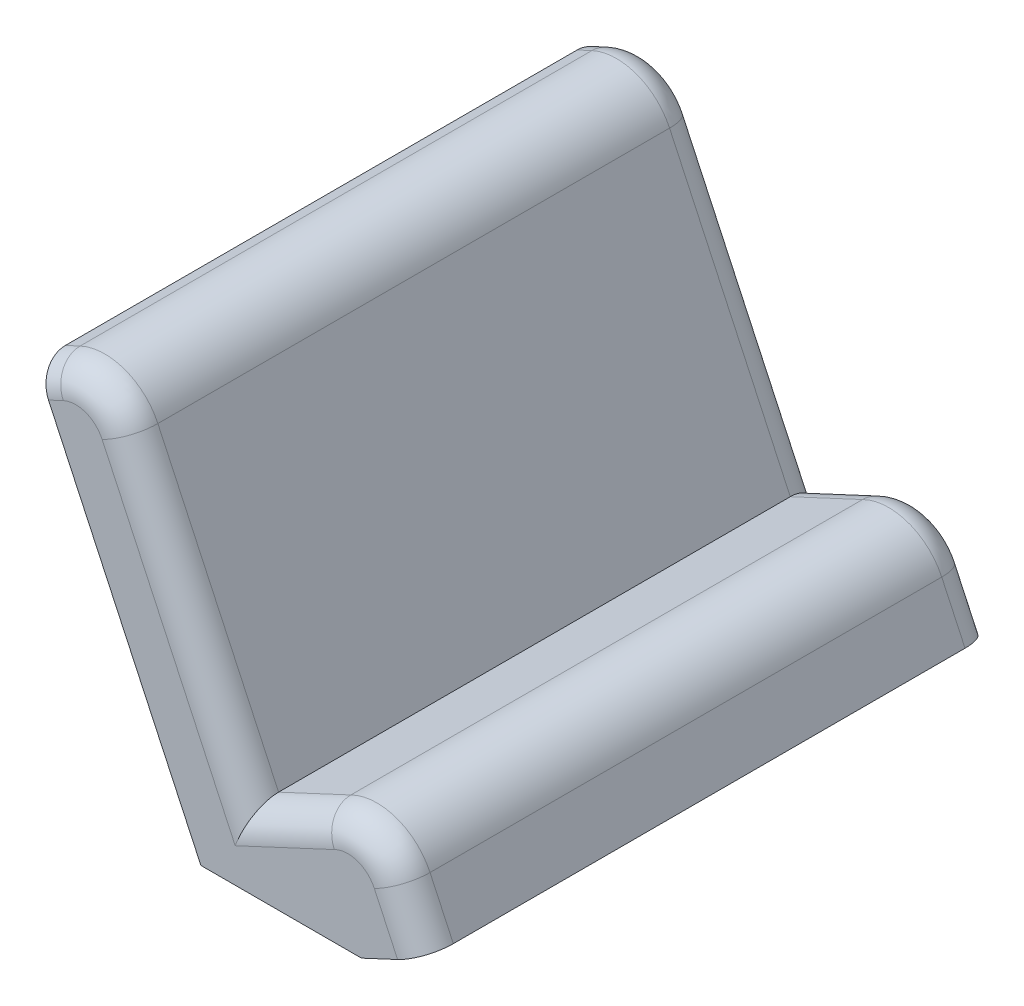
ISO-10303-21;
HEADER;
FILE_DESCRIPTION(('STEP AP214'),'2;1');
FILE_NAME('part.step','',(''),(''),'','','');
FILE_SCHEMA(('AUTOMOTIVE_DESIGN { 1 0 10303 214 1 1 1 1 }'));
ENDSEC;
DATA;
#1=APPLICATION_CONTEXT('core data for automotive mechanical design processes');
#2=APPLICATION_PROTOCOL_DEFINITION('international standard','automotive_design',2000,#1);
#3=PRODUCT_CONTEXT('',#1,'mechanical');
#4=PRODUCT('Part','Part','',(#3));
#5=PRODUCT_RELATED_PRODUCT_CATEGORY('part','',(#4));
#6=PRODUCT_DEFINITION_FORMATION('','',#4);
#7=PRODUCT_DEFINITION_CONTEXT('part definition',#1,'design');
#8=PRODUCT_DEFINITION('design','',#6,#7);
#9=PRODUCT_DEFINITION_SHAPE('','',#8);
#10=(LENGTH_UNIT() NAMED_UNIT(*) SI_UNIT(.MILLI.,.METRE.));
#11=(NAMED_UNIT(*) PLANE_ANGLE_UNIT() SI_UNIT($,.RADIAN.));
#12=(NAMED_UNIT(*) SI_UNIT($,.STERADIAN.) SOLID_ANGLE_UNIT());
#13=UNCERTAINTY_MEASURE_WITH_UNIT(LENGTH_MEASURE(1.E-05),#10,'distance_accuracy_value','');
#14=(GEOMETRIC_REPRESENTATION_CONTEXT(3) GLOBAL_UNCERTAINTY_ASSIGNED_CONTEXT((#13)) GLOBAL_UNIT_ASSIGNED_CONTEXT((#10,
#11,#12)) REPRESENTATION_CONTEXT('',''));
#15=CARTESIAN_POINT('',(0.,0.,0.));
#16=DIRECTION('',(0.,0.,1.));
#17=DIRECTION('',(1.,0.,0.));
#18=AXIS2_PLACEMENT_3D('',#15,#16,#17);
#19=CARTESIAN_POINT('',(-55.9569189786001,120.,97.5));
#20=DIRECTION('',(0.422618261740701,-0.906307787036649,0.));
#21=DIRECTION('',(0.906307787036649,0.422618261740701,0.));
#22=AXIS2_PLACEMENT_3D('',#19,#20,#21);
#23=PLANE('',#22);
#24=DIRECTION('',(-0.906307787036649,-0.422618261740701,0.));
#25=VECTOR('',#24,1.);
#26=CARTESIAN_POINT('',(-55.9569189786001,120.,-87.5));
#27=LINE('',#26,#25);
#28=CARTESIAN_POINT('',(-49.0830747193332,123.205326219061,-87.5));
#29=VERTEX_POINT('',#28);
#30=CARTESIAN_POINT('',(-54.1443034045268,120.845236523481,-87.5));
#31=VERTEX_POINT('',#30);
#32=EDGE_CURVE('E423',#29,#31,#27,.T.);
#33=ORIENTED_EDGE('',*,*,#32,.T.);
#34=DIRECTION('',(0.,0.,1.));
#35=VECTOR('',#34,1.);
#36=CARTESIAN_POINT('',(-54.1443034045268,120.845236523481,97.5));
#37=LINE('',#36,#35);
#38=CARTESIAN_POINT('',(-54.1443034045268,120.845236523481,87.5));
#39=VERTEX_POINT('',#38);
#40=EDGE_CURVE('E69',#31,#39,#37,.T.);
#41=ORIENTED_EDGE('',*,*,#40,.T.);
#42=DIRECTION('',(-0.906307787036649,-0.422618261740701,0.));
#43=VECTOR('',#42,1.);
#44=CARTESIAN_POINT('',(-49.0830747193332,123.205326219061,87.5));
#45=LINE('',#44,#43);
#46=CARTESIAN_POINT('',(-49.0830747193332,123.205326219061,87.5));
#47=VERTEX_POINT('',#46);
#48=EDGE_CURVE('E272',#39,#47,#45,.F.);
#49=ORIENTED_EDGE('',*,*,#48,.T.);
#50=DIRECTION('',(0.,0.,-1.));
#51=VECTOR('',#50,1.);
#52=CARTESIAN_POINT('',(-49.0830747193332,123.205326219061,97.5));
#53=LINE('',#52,#51);
#54=EDGE_CURVE('E209',#47,#29,#53,.T.);
#55=ORIENTED_EDGE('',*,*,#54,.T.);
#56=EDGE_LOOP('',(#33,#41,#49,#55));
#57=FACE_BOUND('',#56,.T.);
#58=ADVANCED_FACE('F43',(#57),#23,.F.);
#59=CARTESIAN_POINT('',(-55.9569189786001,120.,97.5));
#60=DIRECTION('',(0.906307787036649,0.422618261740701,0.));
#61=DIRECTION('',(-0.422618261740701,0.906307787036649,0.));
#62=AXIS2_PLACEMENT_3D('',#59,#60,#61);
#63=PLANE('',#62);
#64=CARTESIAN_POINT('',(-51.7307363611931,110.936922129634,-87.5));
#65=DIRECTION('',(0.906307787036649,0.422618261740701,0.));
#66=DIRECTION('',(-0.422618261740701,0.906307787036649,0.));
#67=AXIS2_PLACEMENT_3D('',#64,#65,#66);
#68=CIRCLE('',#67,8.00000000000005);
#69=CARTESIAN_POINT('',(-55.1116824551187,118.187384425927,-87.5));
#70=VERTEX_POINT('',#69);
#71=CARTESIAN_POINT('',(-51.7307363611931,110.936922129634,-95.5));
#72=VERTEX_POINT('',#71);
#73=EDGE_CURVE('E367',#70,#72,#68,.F.);
#74=ORIENTED_EDGE('',*,*,#73,.T.);
#75=DIRECTION('',(0.422618261740701,-0.906307787036649,0.));
#76=VECTOR('',#75,1.);
#77=CARTESIAN_POINT('',(-55.9569189786001,120.,-95.5000000000001));
#78=LINE('',#77,#76);
#79=CARTESIAN_POINT('',(0.,0.,-95.5000000000001));
#80=VERTEX_POINT('',#79);
#81=EDGE_CURVE('E370',#72,#80,#78,.T.);
#82=ORIENTED_EDGE('',*,*,#81,.T.);
#83=DIRECTION('',(0.,0.,-1.));
#84=VECTOR('',#83,1.);
#85=CARTESIAN_POINT('',(0.,0.,97.5));
#86=LINE('',#85,#84);
#87=CARTESIAN_POINT('',(0.,0.,95.5000000000001));
#88=VERTEX_POINT('',#87);
#89=EDGE_CURVE('E201',#88,#80,#86,.T.);
#90=ORIENTED_EDGE('',*,*,#89,.F.);
#91=DIRECTION('',(-0.422618261740701,0.906307787036649,0.));
#92=VECTOR('',#91,1.);
#93=CARTESIAN_POINT('',(-51.7307363611931,110.936922129634,95.5000000000001));
#94=LINE('',#93,#92);
#95=CARTESIAN_POINT('',(-51.7307363611931,110.936922129634,95.5000000000001));
#96=VERTEX_POINT('',#95);
#97=EDGE_CURVE('E357',#88,#96,#94,.T.);
#98=ORIENTED_EDGE('',*,*,#97,.T.);
#99=CARTESIAN_POINT('',(-51.7307363611931,110.936922129634,87.5));
#100=DIRECTION('',(0.906307787036649,0.422618261740701,0.));
#101=DIRECTION('',(-0.422618261740701,0.906307787036649,0.));
#102=AXIS2_PLACEMENT_3D('',#99,#100,#101);
#103=CIRCLE('',#102,8.00000000000007);
#104=CARTESIAN_POINT('',(-55.1116824551187,118.187384425927,87.5));
#105=VERTEX_POINT('',#104);
#106=EDGE_CURVE('E360',#96,#105,#103,.F.);
#107=ORIENTED_EDGE('',*,*,#106,.T.);
#108=DIRECTION('',(0.,0.,-1.));
#109=VECTOR('',#108,1.);
#110=CARTESIAN_POINT('',(-55.1116824551187,118.187384425927,97.5));
#111=LINE('',#110,#109);
#112=EDGE_CURVE('E364',#105,#70,#111,.T.);
#113=ORIENTED_EDGE('',*,*,#112,.T.);
#114=EDGE_LOOP('',(#74,#82,#90,#98,#107,#113));
#115=FACE_BOUND('',#114,.T.);
#116=ADVANCED_FACE('F506',(#115),#63,.F.);
#117=CARTESIAN_POINT('',(0.,0.,97.5));
#118=DIRECTION('',(0.,1.,0.));
#119=DIRECTION('',(0.,0.,1.));
#120=AXIS2_PLACEMENT_3D('',#117,#118,#119);
#121=PLANE('',#120);
#122=CARTESIAN_POINT('',(30.,0.,0.));
#123=DIRECTION('',(0.,1.,0.));
#124=DIRECTION('',(0.,0.,1.));
#125=AXIS2_PLACEMENT_3D('',#122,#123,#124);
#126=CIRCLE('',#125,7.5);
#127=CARTESIAN_POINT('',(30.,0.,7.5));
#128=VERTEX_POINT('',#127);
#129=EDGE_CURVE('E242',#128,#128,#126,.F.);
#130=ORIENTED_EDGE('',*,*,#129,.F.);
#131=EDGE_LOOP('',(#130));
#132=FACE_BOUND('',#131,.T.);
#133=ORIENTED_EDGE('',*,*,#89,.T.);
#134=DIRECTION('',(-0.74096564527329,0.,0.671542934237817));
#135=VECTOR('',#134,1.);
#136=CARTESIAN_POINT('',(-30.722032121667,0.,-67.6563830545432));
#137=LINE('',#136,#135);
#138=CARTESIAN_POINT('',(2.20675583792493,0.,-97.5));
#139=VERTEX_POINT('',#138);
#140=EDGE_CURVE('E377',#80,#139,#137,.F.);
#141=ORIENTED_EDGE('',*,*,#140,.T.);
#142=DIRECTION('',(1.,0.,0.));
#143=VECTOR('',#142,1.);
#144=CARTESIAN_POINT('',(0.,0.,-97.5));
#145=LINE('',#144,#143);
#146=CARTESIAN_POINT('',(57.1,0.,-97.5));
#147=VERTEX_POINT('',#146);
#148=EDGE_CURVE('E196',#139,#147,#145,.T.);
#149=ORIENTED_EDGE('',*,*,#148,.T.);
#150=DIRECTION('',(0.,0.,-1.));
#151=VECTOR('',#150,1.);
#152=CARTESIAN_POINT('',(57.1,0.,97.5));
#153=LINE('',#152,#151);
#154=CARTESIAN_POINT('',(57.1,0.,97.5));
#155=VERTEX_POINT('',#154);
#156=EDGE_CURVE('E192',#155,#147,#153,.T.);
#157=ORIENTED_EDGE('',*,*,#156,.F.);
#158=DIRECTION('',(1.,0.,0.));
#159=VECTOR('',#158,1.);
#160=CARTESIAN_POINT('',(0.,0.,97.5));
#161=LINE('',#160,#159);
#162=CARTESIAN_POINT('',(2.20675583792493,0.,97.5));
#163=VERTEX_POINT('',#162);
#164=EDGE_CURVE('E178',#163,#155,#161,.T.);
#165=ORIENTED_EDGE('',*,*,#164,.F.);
#166=DIRECTION('',(-0.74096564527329,0.,-0.671542934237817));
#167=VECTOR('',#166,1.);
#168=CARTESIAN_POINT('',(-24.0910683230393,0.,73.6660771807977));
#169=LINE('',#168,#167);
#170=EDGE_CURVE('E374',#163,#88,#169,.T.);
#171=ORIENTED_EDGE('',*,*,#170,.T.);
#172=EDGE_LOOP('',(#133,#141,#149,#157,#165,#171));
#173=FACE_BOUND('',#172,.T.);
#174=ADVANCED_FACE('F194',(#132,#173),#121,.F.);
#175=CARTESIAN_POINT('',(57.1,0.,97.5));
#176=DIRECTION('',(-0.422618261740701,0.906307787036649,0.));
#177=DIRECTION('',(-0.906307787036649,-0.422618261740701,0.));
#178=AXIS2_PLACEMENT_3D('',#175,#176,#177);
#179=PLANE('',#178);
#180=DIRECTION('',(0.906307787036649,0.422618261740701,0.));
#181=VECTOR('',#180,1.);
#182=CARTESIAN_POINT('',(57.1,0.,-97.5));
#183=LINE('',#182,#181);
#184=CARTESIAN_POINT('',(69.481991334729,5.77381738259299,-97.5));
#185=VERTEX_POINT('',#184);
#186=EDGE_CURVE('E189',#147,#185,#183,.T.);
#187=ORIENTED_EDGE('',*,*,#186,.T.);
#188=CARTESIAN_POINT('',(69.481991334729,5.77381738259299,-87.5));
#189=DIRECTION('',(-0.422618261740701,0.906307787036649,0.));
#190=DIRECTION('',(-0.906307787036649,-0.422618261740701,0.));
#191=AXIS2_PLACEMENT_3D('',#188,#189,#190);
#192=CIRCLE('',#191,10.);
#193=CARTESIAN_POINT('',(78.5450692050955,10.,-87.5));
#194=VERTEX_POINT('',#193);
#195=EDGE_CURVE('E438',#185,#194,#192,.F.);
#196=ORIENTED_EDGE('',*,*,#195,.T.);
#197=DIRECTION('',(0.,0.,-1.));
#198=VECTOR('',#197,1.);
#199=CARTESIAN_POINT('',(78.5450692050955,10.,97.5));
#200=LINE('',#199,#198);
#201=CARTESIAN_POINT('',(78.5450692050955,10.,87.5));
#202=VERTEX_POINT('',#201);
#203=EDGE_CURVE('E202',#202,#194,#200,.T.);
#204=ORIENTED_EDGE('',*,*,#203,.F.);
#205=CARTESIAN_POINT('',(69.481991334729,5.77381738259297,87.5));
#206=DIRECTION('',(-0.422618261740701,0.906307787036649,0.));
#207=DIRECTION('',(-0.906307787036649,-0.422618261740701,0.));
#208=AXIS2_PLACEMENT_3D('',#205,#206,#207);
#209=CIRCLE('',#208,10.);
#210=CARTESIAN_POINT('',(69.481991334729,5.77381738259299,97.5));
#211=VERTEX_POINT('',#210);
#212=EDGE_CURVE('E207',#202,#211,#209,.F.);
#213=ORIENTED_EDGE('',*,*,#212,.T.);
#214=DIRECTION('',(0.906307787036649,0.422618261740701,0.));
#215=VECTOR('',#214,1.);
#216=CARTESIAN_POINT('',(57.1,0.,97.5));
#217=LINE('',#216,#215);
#218=EDGE_CURVE('E183',#155,#211,#217,.T.);
#219=ORIENTED_EDGE('',*,*,#218,.F.);
#220=ORIENTED_EDGE('',*,*,#156,.T.);
#221=EDGE_LOOP('',(#187,#196,#204,#213,#219,#220));
#222=FACE_BOUND('',#221,.T.);
#223=ADVANCED_FACE('F204',(#222),#179,.F.);
#224=CARTESIAN_POINT('',(78.5450692050955,10.,97.5));
#225=DIRECTION('',(-0.906307787036649,-0.422618261740702,0.));
#226=DIRECTION('',(0.422618261740702,-0.906307787036649,0.));
#227=AXIS2_PLACEMENT_3D('',#224,#225,#226);
#228=PLANE('',#227);
#229=ORIENTED_EDGE('',*,*,#203,.T.);
#230=DIRECTION('',(-0.422618261740702,0.906307787036649,0.));
#231=VECTOR('',#230,1.);
#232=CARTESIAN_POINT('',(78.5450692050955,10.,-87.5));
#233=LINE('',#232,#231);
#234=CARTESIAN_POINT('',(70.5740684534012,27.0938662753953,-87.5));
#235=VERTEX_POINT('',#234);
#236=EDGE_CURVE('E284',#194,#235,#233,.T.);
#237=ORIENTED_EDGE('',*,*,#236,.T.);
#238=DIRECTION('',(0.,0.,-1.));
#239=VECTOR('',#238,1.);
#240=CARTESIAN_POINT('',(70.5740684534012,27.0938662753953,97.5));
#241=LINE('',#240,#239);
#242=CARTESIAN_POINT('',(70.5740684534012,27.0938662753953,87.5));
#243=VERTEX_POINT('',#242);
#244=EDGE_CURVE('E233',#243,#235,#241,.T.);
#245=ORIENTED_EDGE('',*,*,#244,.F.);
#246=DIRECTION('',(-0.422618261740702,0.906307787036649,0.));
#247=VECTOR('',#246,1.);
#248=CARTESIAN_POINT('',(78.5450692050955,9.99999999999997,87.5));
#249=LINE('',#248,#247);
#250=EDGE_CURVE('E264',#243,#202,#249,.F.);
#251=ORIENTED_EDGE('',*,*,#250,.T.);
#252=EDGE_LOOP('',(#229,#237,#245,#251));
#253=FACE_BOUND('',#252,.T.);
#254=ADVANCED_FACE('F427',(#253),#228,.F.);
#255=CARTESIAN_POINT('',(52.4479127126682,18.6415010405812,97.5));
#256=DIRECTION('',(0.,0.,-1.));
#257=DIRECTION('',(-1.,0.,0.));
#258=AXIS2_PLACEMENT_3D('',#255,#256,#257);
#259=CYLINDRICAL_SURFACE('',#258,20.);
#260=ORIENTED_EDGE('',*,*,#244,.T.);
#261=CARTESIAN_POINT('',(52.4479127126682,18.6415010405812,-87.5));
#262=DIRECTION('',(0.,0.,1.));
#263=DIRECTION('',(1.,0.,0.));
#264=AXIS2_PLACEMENT_3D('',#261,#262,#263);
#265=CIRCLE('',#264,20.);
#266=CARTESIAN_POINT('',(43.49,36.5232179556937,-87.5));
#267=VERTEX_POINT('',#266);
#268=EDGE_CURVE('E417',#235,#267,#265,.T.);
#269=ORIENTED_EDGE('',*,*,#268,.T.);
#270=DIRECTION('',(0.,0.,-1.));
#271=VECTOR('',#270,1.);
#272=CARTESIAN_POINT('',(43.49,36.5232179556937,97.5));
#273=LINE('',#272,#271);
#274=CARTESIAN_POINT('',(43.49,36.5232179556937,87.5));
#275=VERTEX_POINT('',#274);
#276=EDGE_CURVE('E229',#275,#267,#273,.T.);
#277=ORIENTED_EDGE('',*,*,#276,.F.);
#278=CARTESIAN_POINT('',(52.4479127126682,18.6415010405812,87.5));
#279=DIRECTION('',(0.,0.,1.));
#280=DIRECTION('',(1.,0.,0.));
#281=AXIS2_PLACEMENT_3D('',#278,#279,#280);
#282=CIRCLE('',#281,20.);
#283=EDGE_CURVE('E275',#275,#243,#282,.F.);
#284=ORIENTED_EDGE('',*,*,#283,.T.);
#285=EDGE_LOOP('',(#260,#269,#277,#284));
#286=FACE_BOUND('',#285,.T.);
#287=ADVANCED_FACE('F432',(#286),#259,.T.);
#288=CARTESIAN_POINT('',(43.49,36.5232179556937,97.5));
#289=DIRECTION('',(0.4226182617407,-0.906307787036649,0.));
#290=DIRECTION('',(0.906307787036649,0.4226182617407,0.));
#291=AXIS2_PLACEMENT_3D('',#288,#289,#290);
#292=PLANE('',#291);
#293=ORIENTED_EDGE('',*,*,#276,.T.);
#294=DIRECTION('',(-0.906307787036649,-0.4226182617407,0.));
#295=VECTOR('',#294,1.);
#296=CARTESIAN_POINT('',(43.49,36.5232179556937,-87.5));
#297=LINE('',#296,#295);
#298=CARTESIAN_POINT('',(18.778379347475,25.,-87.5));
#299=VERTEX_POINT('',#298);
#300=EDGE_CURVE('E422',#267,#299,#297,.T.);
#301=ORIENTED_EDGE('',*,*,#300,.T.);
#302=DIRECTION('',(0.,0.,-1.));
#303=VECTOR('',#302,1.);
#304=CARTESIAN_POINT('',(18.778379347475,25.,97.5));
#305=LINE('',#304,#303);
#306=CARTESIAN_POINT('',(18.778379347475,25.,87.5));
#307=VERTEX_POINT('',#306);
#308=EDGE_CURVE('E225',#307,#299,#305,.T.);
#309=ORIENTED_EDGE('',*,*,#308,.F.);
#310=DIRECTION('',(-0.906307787036649,-0.4226182617407,0.));
#311=VECTOR('',#310,1.);
#312=CARTESIAN_POINT('',(43.49,36.5232179556937,87.5));
#313=LINE('',#312,#311);
#314=EDGE_CURVE('E278',#307,#275,#313,.F.);
#315=ORIENTED_EDGE('',*,*,#314,.T.);
#316=EDGE_LOOP('',(#293,#301,#309,#315));
#317=FACE_BOUND('',#316,.T.);
#318=ADVANCED_FACE('F491',(#317),#292,.F.);
#319=CARTESIAN_POINT('',(18.778379347475,25.,97.5));
#320=DIRECTION('',(-0.906307787036649,-0.422618261740701,0.));
#321=DIRECTION('',(0.422618261740701,-0.906307787036649,0.));
#322=AXIS2_PLACEMENT_3D('',#319,#320,#321);
#323=PLANE('',#322);
#324=ORIENTED_EDGE('',*,*,#308,.T.);
#325=DIRECTION('',(-0.422618261740701,0.906307787036649,0.));
#326=VECTOR('',#325,1.);
#327=CARTESIAN_POINT('',(18.778379347475,25.,-87.5));
#328=LINE('',#327,#326);
#329=CARTESIAN_POINT('',(-22.504553743786,113.531535713142,-87.5));
#330=VERTEX_POINT('',#329);
#331=EDGE_CURVE('E440',#299,#330,#328,.T.);
#332=ORIENTED_EDGE('',*,*,#331,.T.);
#333=DIRECTION('',(0.,0.,-1.));
#334=VECTOR('',#333,1.);
#335=CARTESIAN_POINT('',(-22.504553743786,113.531535713142,97.5));
#336=LINE('',#335,#334);
#337=CARTESIAN_POINT('',(-22.504553743786,113.531535713142,87.5));
#338=VERTEX_POINT('',#337);
#339=EDGE_CURVE('E213',#338,#330,#336,.T.);
#340=ORIENTED_EDGE('',*,*,#339,.F.);
#341=DIRECTION('',(-0.422618261740701,0.906307787036649,0.));
#342=VECTOR('',#341,1.);
#343=CARTESIAN_POINT('',(18.778379347475,25.,87.5));
#344=LINE('',#343,#342);
#345=EDGE_CURVE('E269',#338,#307,#344,.F.);
#346=ORIENTED_EDGE('',*,*,#345,.T.);
#347=EDGE_LOOP('',(#324,#332,#340,#346));
#348=FACE_BOUND('',#347,.T.);
#349=ADVANCED_FACE('F495',(#348),#323,.F.);
#350=CARTESIAN_POINT('',(-40.6307094845191,105.079170478328,97.5));
#351=DIRECTION('',(0.,0.,-1.));
#352=DIRECTION('',(-1.,0.,0.));
#353=AXIS2_PLACEMENT_3D('',#350,#351,#352);
#354=CYLINDRICAL_SURFACE('',#353,20.);
#355=ORIENTED_EDGE('',*,*,#339,.T.);
#356=CARTESIAN_POINT('',(-40.6307094845191,105.079170478328,-87.5));
#357=DIRECTION('',(0.,0.,1.));
#358=DIRECTION('',(1.,0.,0.));
#359=AXIS2_PLACEMENT_3D('',#356,#357,#358);
#360=CIRCLE('',#359,20.);
#361=EDGE_CURVE('E361',#330,#29,#360,.T.);
#362=ORIENTED_EDGE('',*,*,#361,.T.);
#363=ORIENTED_EDGE('',*,*,#54,.F.);
#364=CARTESIAN_POINT('',(-40.6307094845191,105.079170478328,87.5));
#365=DIRECTION('',(0.,0.,1.));
#366=DIRECTION('',(1.,0.,0.));
#367=AXIS2_PLACEMENT_3D('',#364,#365,#366);
#368=CIRCLE('',#367,20.);
#369=EDGE_CURVE('E281',#47,#338,#368,.F.);
#370=ORIENTED_EDGE('',*,*,#369,.T.);
#371=EDGE_LOOP('',(#355,#362,#363,#370));
#372=FACE_BOUND('',#371,.T.);
#373=ADVANCED_FACE('F456',(#372),#354,.T.);
#374=CARTESIAN_POINT('',(-40.6307094845191,105.079170478328,97.5));
#375=DIRECTION('',(0.,0.,1.));
#376=DIRECTION('',(1.,0.,0.));
#377=AXIS2_PLACEMENT_3D('',#374,#375,#376);
#378=PLANE('',#377);
#379=DIRECTION('',(-0.906307787036649,-0.422618261740701,0.));
#380=VECTOR('',#379,1.);
#381=CARTESIAN_POINT('',(-51.7307363611931,110.936922129634,97.5));
#382=LINE('',#381,#380);
#383=CARTESIAN_POINT('',(-44.8568921019262,114.142248348694,97.5));
#384=VERTEX_POINT('',#383);
#385=CARTESIAN_POINT('',(-49.9181207871198,111.782158653115,97.5));
#386=VERTEX_POINT('',#385);
#387=EDGE_CURVE('E249',#384,#386,#382,.T.);
#388=ORIENTED_EDGE('',*,*,#387,.T.);
#389=DIRECTION('',(0.422618261740701,-0.906307787036649,0.));
#390=VECTOR('',#389,1.);
#391=CARTESIAN_POINT('',(1.81261557407325,0.845236523481382,97.5));
#392=LINE('',#391,#390);
#393=EDGE_CURVE('E11',#386,#163,#392,.T.);
#394=ORIENTED_EDGE('',*,*,#393,.T.);
#395=ORIENTED_EDGE('',*,*,#164,.T.);
#396=ORIENTED_EDGE('',*,*,#218,.T.);
#397=DIRECTION('',(-0.422618261740702,0.906307787036649,0.));
#398=VECTOR('',#397,1.);
#399=CARTESIAN_POINT('',(61.5109905830347,22.8676836579882,97.5));
#400=LINE('',#399,#398);
#401=CARTESIAN_POINT('',(61.5109905830347,22.8676836579882,97.5));
#402=VERTEX_POINT('',#401);
#403=EDGE_CURVE('E261',#211,#402,#400,.T.);
#404=ORIENTED_EDGE('',*,*,#403,.T.);
#405=CARTESIAN_POINT('',(52.4479127126682,18.6415010405812,97.5));
#406=DIRECTION('',(0.,0.,1.));
#407=DIRECTION('',(1.,0.,0.));
#408=AXIS2_PLACEMENT_3D('',#405,#406,#407);
#409=CIRCLE('',#408,10.);
#410=CARTESIAN_POINT('',(47.8652653123671,27.5296584876854,97.5));
#411=VERTEX_POINT('',#410);
#412=EDGE_CURVE('E258',#402,#411,#409,.T.);
#413=ORIENTED_EDGE('',*,*,#412,.T.);
#414=DIRECTION('',(-0.906307787036649,-0.4226182617407,0.));
#415=VECTOR('',#414,1.);
#416=CARTESIAN_POINT('',(23.004561964882,15.9369221296335,97.5));
#417=LINE('',#416,#415);
#418=CARTESIAN_POINT('',(13.9414840945155,11.7107395122265,97.5));
#419=VERTEX_POINT('',#418);
#420=EDGE_CURVE('E255',#411,#419,#417,.T.);
#421=ORIENTED_EDGE('',*,*,#420,.T.);
#422=DIRECTION('',(-0.422618261740701,0.906307787036649,0.));
#423=VECTOR('',#422,1.);
#424=CARTESIAN_POINT('',(-31.5676316141525,109.305353095735,97.5));
#425=LINE('',#424,#423);
#426=CARTESIAN_POINT('',(-31.5676316141525,109.305353095735,97.5));
#427=VERTEX_POINT('',#426);
#428=EDGE_CURVE('E252',#419,#427,#425,.T.);
#429=ORIENTED_EDGE('',*,*,#428,.T.);
#430=CARTESIAN_POINT('',(-40.6307094845191,105.079170478328,97.5));
#431=DIRECTION('',(0.,0.,1.));
#432=DIRECTION('',(1.,0.,0.));
#433=AXIS2_PLACEMENT_3D('',#430,#431,#432);
#434=CIRCLE('',#433,10.);
#435=EDGE_CURVE('E246',#427,#384,#434,.T.);
#436=ORIENTED_EDGE('',*,*,#435,.T.);
#437=EDGE_LOOP('',(#388,#394,#395,#396,#404,#413,#421,#429,#436));
#438=FACE_BOUND('',#437,.T.);
#439=ADVANCED_FACE('F180',(#438),#378,.T.);
#440=CARTESIAN_POINT('',(-40.6307094845191,105.079170478328,-97.5));
#441=DIRECTION('',(0.,0.,1.));
#442=DIRECTION('',(1.,0.,0.));
#443=AXIS2_PLACEMENT_3D('',#440,#441,#442);
#444=PLANE('',#443);
#445=ORIENTED_EDGE('',*,*,#148,.F.);
#446=DIRECTION('',(-0.422618261740701,0.906307787036649,0.));
#447=VECTOR('',#446,1.);
#448=CARTESIAN_POINT('',(-45.6919381697128,102.719080782748,-97.5));
#449=LINE('',#448,#447);
#450=CARTESIAN_POINT('',(-49.9181207871198,111.782158653115,-97.5));
#451=VERTEX_POINT('',#450);
#452=EDGE_CURVE('E380',#139,#451,#449,.T.);
#453=ORIENTED_EDGE('',*,*,#452,.T.);
#454=DIRECTION('',(-0.906307787036649,-0.422618261740701,0.));
#455=VECTOR('',#454,1.);
#456=CARTESIAN_POINT('',(-44.8568921019261,114.142248348695,-97.5));
#457=LINE('',#456,#455);
#458=CARTESIAN_POINT('',(-44.8568921019262,114.142248348694,-97.5));
#459=VERTEX_POINT('',#458);
#460=EDGE_CURVE('E472',#451,#459,#457,.F.);
#461=ORIENTED_EDGE('',*,*,#460,.T.);
#462=CARTESIAN_POINT('',(-40.6307094845191,105.079170478328,-97.5));
#463=DIRECTION('',(0.,0.,1.));
#464=DIRECTION('',(1.,0.,0.));
#465=AXIS2_PLACEMENT_3D('',#462,#463,#464);
#466=CIRCLE('',#465,10.);
#467=CARTESIAN_POINT('',(-31.5676316141525,109.305353095735,-97.5));
#468=VERTEX_POINT('',#467);
#469=EDGE_CURVE('E430',#459,#468,#466,.F.);
#470=ORIENTED_EDGE('',*,*,#469,.T.);
#471=DIRECTION('',(-0.422618261740701,0.906307787036649,0.));
#472=VECTOR('',#471,1.);
#473=CARTESIAN_POINT('',(-31.5676316141526,109.305353095735,-97.5));
#474=LINE('',#473,#472);
#475=CARTESIAN_POINT('',(13.9414840945155,11.7107395122265,-97.5));
#476=VERTEX_POINT('',#475);
#477=EDGE_CURVE('E475',#468,#476,#474,.F.);
#478=ORIENTED_EDGE('',*,*,#477,.T.);
#479=DIRECTION('',(-0.906307787036649,-0.4226182617407,0.));
#480=VECTOR('',#479,1.);
#481=CARTESIAN_POINT('',(4.87840622414896,7.48455689481947,-97.5));
#482=LINE('',#481,#480);
#483=CARTESIAN_POINT('',(47.8652653123671,27.5296584876855,-97.5));
#484=VERTEX_POINT('',#483);
#485=EDGE_CURVE('E481',#476,#484,#482,.F.);
#486=ORIENTED_EDGE('',*,*,#485,.T.);
#487=CARTESIAN_POINT('',(52.4479127126682,18.6415010405812,-97.5));
#488=DIRECTION('',(0.,0.,1.));
#489=DIRECTION('',(1.,0.,0.));
#490=AXIS2_PLACEMENT_3D('',#487,#488,#489);
#491=CIRCLE('',#490,10.);
#492=CARTESIAN_POINT('',(61.5109905830347,22.8676836579882,-97.5));
#493=VERTEX_POINT('',#492);
#494=EDGE_CURVE('E445',#484,#493,#491,.F.);
#495=ORIENTED_EDGE('',*,*,#494,.T.);
#496=DIRECTION('',(-0.422618261740702,0.906307787036649,0.));
#497=VECTOR('',#496,1.);
#498=CARTESIAN_POINT('',(11.7790238474935,129.518230492907,-97.5));
#499=LINE('',#498,#497);
#500=EDGE_CURVE('E415',#493,#185,#499,.F.);
#501=ORIENTED_EDGE('',*,*,#500,.T.);
#502=ORIENTED_EDGE('',*,*,#186,.F.);
#503=EDGE_LOOP('',(#445,#453,#461,#470,#478,#486,#495,#501,#502));
#504=FACE_BOUND('',#503,.T.);
#505=ADVANCED_FACE('F484',(#504),#444,.F.);
#506=CARTESIAN_POINT('',(30.,-10.,0.));
#507=DIRECTION('',(0.,1.,0.));
#508=DIRECTION('',(0.,0.,1.));
#509=AXIS2_PLACEMENT_3D('',#506,#507,#508);
#510=CYLINDRICAL_SURFACE('',#509,7.5);
#511=CARTESIAN_POINT('',(30.,-10.,0.));
#512=DIRECTION('',(0.,-1.,0.));
#513=DIRECTION('',(0.,0.,-1.));
#514=AXIS2_PLACEMENT_3D('',#511,#512,#513);
#515=CIRCLE('',#514,7.5);
#516=CARTESIAN_POINT('',(30.,-10.,-7.5));
#517=VERTEX_POINT('',#516);
#518=EDGE_CURVE('E219',#517,#517,#515,.T.);
#519=ORIENTED_EDGE('',*,*,#518,.F.);
#520=EDGE_LOOP('',(#519));
#521=FACE_BOUND('',#520,.T.);
#522=ORIENTED_EDGE('',*,*,#129,.T.);
#523=EDGE_LOOP('',(#522));
#524=FACE_BOUND('',#523,.T.);
#525=ADVANCED_FACE('F675',(#521,#524),#510,.T.);
#526=CARTESIAN_POINT('',(30.,-10.,0.));
#527=DIRECTION('',(0.,-1.,0.));
#528=DIRECTION('',(0.,0.,-1.));
#529=AXIS2_PLACEMENT_3D('',#526,#527,#528);
#530=PLANE('',#529);
#531=ORIENTED_EDGE('',*,*,#518,.T.);
#532=EDGE_LOOP('',(#531));
#533=FACE_BOUND('',#532,.T.);
#534=ADVANCED_FACE('F321',(#533),#530,.T.);
#535=CARTESIAN_POINT('',(-44.8568921019261,114.142248348695,87.5));
#536=DIRECTION('',(0.906307787036649,0.422618261740701,0.));
#537=DIRECTION('',(-0.422618261740701,0.906307787036649,0.));
#538=AXIS2_PLACEMENT_3D('',#535,#536,#537);
#539=CYLINDRICAL_SURFACE('',#538,10.);
#540=ORIENTED_EDGE('',*,*,#48,.F.);
#541=CARTESIAN_POINT('',(-49.9181207871198,111.782158653115,87.5));
#542=DIRECTION('',(0.906307787036649,0.422618261740702,0.));
#543=DIRECTION('',(-0.422618261740702,0.906307787036649,0.));
#544=AXIS2_PLACEMENT_3D('',#541,#542,#543);
#545=CIRCLE('',#544,10.);
#546=EDGE_CURVE('E54',#39,#386,#545,.T.);
#547=ORIENTED_EDGE('',*,*,#546,.T.);
#548=ORIENTED_EDGE('',*,*,#387,.F.);
#549=CARTESIAN_POINT('',(-44.8568921019262,114.142248348694,87.5));
#550=DIRECTION('',(0.906307787036649,0.422618261740701,0.));
#551=DIRECTION('',(-0.422618261740701,0.906307787036649,0.));
#552=AXIS2_PLACEMENT_3D('',#549,#550,#551);
#553=CIRCLE('',#552,10.);
#554=EDGE_CURVE('E732',#47,#384,#553,.T.);
#555=ORIENTED_EDGE('',*,*,#554,.F.);
#556=EDGE_LOOP('',(#540,#547,#548,#555));
#557=FACE_BOUND('',#556,.T.);
#558=ADVANCED_FACE('F317',(#557),#539,.T.);
#559=CARTESIAN_POINT('',(-40.6307094845191,105.079170478328,87.5));
#560=DIRECTION('',(0.,0.,1.));
#561=DIRECTION('',(1.,0.,0.));
#562=AXIS2_PLACEMENT_3D('',#559,#560,#561);
#563=DEGENERATE_TOROIDAL_SURFACE('',#562,10.,10.,.T.);
#564=ORIENTED_EDGE('',*,*,#554,.T.);
#565=ORIENTED_EDGE('',*,*,#435,.F.);
#566=CARTESIAN_POINT('',(-31.5676316141525,109.305353095735,87.5));
#567=DIRECTION('',(0.422618261740694,-0.906307787036652,0.));
#568=DIRECTION('',(0.906307787036653,0.422618261740694,0.));
#569=AXIS2_PLACEMENT_3D('',#566,#567,#568);
#570=CIRCLE('',#569,10.);
#571=EDGE_CURVE('E735',#338,#427,#570,.T.);
#572=ORIENTED_EDGE('',*,*,#571,.F.);
#573=ORIENTED_EDGE('',*,*,#369,.F.);
#574=EDGE_LOOP('',(#564,#565,#572,#573));
#575=FACE_BOUND('',#574,.T.);
#576=ADVANCED_FACE('F313',(#575),#563,.T.);
#577=CARTESIAN_POINT('',(-31.5676316141526,109.305353095735,87.5));
#578=DIRECTION('',(0.422618261740701,-0.906307787036649,0.));
#579=DIRECTION('',(0.906307787036649,0.422618261740701,0.));
#580=AXIS2_PLACEMENT_3D('',#577,#578,#579);
#581=CYLINDRICAL_SURFACE('',#580,10.);
#582=ORIENTED_EDGE('',*,*,#571,.T.);
#583=ORIENTED_EDGE('',*,*,#428,.F.);
#584=CARTESIAN_POINT('',(13.9414840945155,11.7107395122265,87.5));
#585=DIRECTION('',(0.939692620785909,-0.342020143325667,0.));
#586=DIRECTION('',(-0.342020143325667,-0.939692620785909,0.));
#587=AXIS2_PLACEMENT_3D('',#584,#585,#586);
#588=ELLIPSE('',#587,14.1421356237309,10.);
#589=EDGE_CURVE('E299',#307,#419,#588,.T.);
#590=ORIENTED_EDGE('',*,*,#589,.F.);
#591=ORIENTED_EDGE('',*,*,#345,.F.);
#592=EDGE_LOOP('',(#582,#583,#590,#591));
#593=FACE_BOUND('',#592,.T.);
#594=ADVANCED_FACE('F310',(#593),#581,.T.);
#595=CARTESIAN_POINT('',(4.87840622414896,7.48455689481947,87.5));
#596=DIRECTION('',(0.906307787036649,0.4226182617407,0.));
#597=DIRECTION('',(-0.4226182617407,0.906307787036649,0.));
#598=AXIS2_PLACEMENT_3D('',#595,#596,#597);
#599=CYLINDRICAL_SURFACE('',#598,10.);
#600=ORIENTED_EDGE('',*,*,#589,.T.);
#601=ORIENTED_EDGE('',*,*,#420,.F.);
#602=CARTESIAN_POINT('',(43.49,36.5232179556937,87.5));
#603=CARTESIAN_POINT('',(43.4899871215679,36.5232453302412,87.7812295039492));
#604=CARTESIAN_POINT('',(43.4951641503939,36.5125375098579,88.0624546489469));
#605=CARTESIAN_POINT('',(43.5158049756473,36.469849190248,88.6228928855631));
#606=CARTESIAN_POINT('',(43.5312682783648,36.4378697119965,88.9021060730993));
#607=CARTESIAN_POINT('',(43.5723743960123,36.3528651688436,89.456352635193));
#608=CARTESIAN_POINT('',(43.5980101606097,36.2998546801251,89.7313887679945));
#609=CARTESIAN_POINT('',(43.6592786644744,36.1731759342206,90.2755222709453));
#610=CARTESIAN_POINT('',(43.6949112822606,36.0995079280636,90.5446197132184));
#611=CARTESIAN_POINT('',(43.775946157921,35.9319983029918,91.0750925504011));
#612=CARTESIAN_POINT('',(43.8213530144486,35.8381471882045,91.3364642443865));
#613=CARTESIAN_POINT('',(43.9216113600861,35.6309613688761,91.8495000923967));
#614=CARTESIAN_POINT('',(43.9764630491034,35.5176262519405,92.1011640408112));
#615=CARTESIAN_POINT('',(44.095214682875,35.2723136373322,92.5929299681475));
#616=CARTESIAN_POINT('',(44.1591124468546,35.1403406327906,92.8330347150535));
#617=CARTESIAN_POINT('',(44.2955217123916,34.8586757873788,93.3000395193192));
#618=CARTESIAN_POINT('',(44.3680331657883,34.7089840455774,93.526939650498));
#619=CARTESIAN_POINT('',(44.5211659528223,34.3929518959291,93.9659232803187));
#620=CARTESIAN_POINT('',(44.6017872428108,34.2266115776882,94.1780068586959));
#621=CARTESIAN_POINT('',(44.7705801818155,33.8784705290848,94.5858520054607));
#622=CARTESIAN_POINT('',(44.8587518320527,33.6966697962221,94.7816135712087));
#623=CARTESIAN_POINT('',(45.0420637901317,33.3188449401421,95.1554858265513));
#624=CARTESIAN_POINT('',(45.1372063882781,33.1228161424948,95.3335906693962));
#625=CARTESIAN_POINT('',(45.333772215973,32.7179941660196,95.6708070788403));
#626=CARTESIAN_POINT('',(45.4351953300009,32.50920122197,95.8299189946283));
#627=CARTESIAN_POINT('',(45.6436579941977,32.0802632331269,96.1280767738497));
#628=CARTESIAN_POINT('',(45.7506995602444,31.8601141142791,96.2671153670162));
#629=CARTESIAN_POINT('',(45.9696203252006,31.4101141730733,96.5240671113721));
#630=CARTESIAN_POINT('',(46.0814994364155,31.1802635265855,96.6419806453157));
#631=CARTESIAN_POINT('',(46.3092474413575,30.7126542062133,96.8557767714031));
#632=CARTESIAN_POINT('',(46.4251136246386,30.4749009082239,96.9516740030178));
#633=CARTESIAN_POINT('',(46.6600626774804,29.9931272272217,97.1208302284468));
#634=CARTESIAN_POINT('',(46.7791445843612,29.7491087208562,97.1940959174529));
#635=CARTESIAN_POINT('',(47.0504359162504,29.1936191452136,97.3332514663889));
#636=CARTESIAN_POINT('',(47.2033509255996,28.8808121506991,97.3924986063882));
#637=CARTESIAN_POINT('',(47.5111487803704,28.2518835597255,97.4738239140229));
#638=CARTESIAN_POINT('',(47.6660280639942,27.9357681057029,97.4959617282038));
#639=CARTESIAN_POINT('',(47.8357876425455,27.5897338765327,97.4998324214543));
#640=CARTESIAN_POINT('',(47.8505262442828,27.5596947631476,97.5000003213832));
#641=CARTESIAN_POINT('',(47.8652653123675,27.5296584876855,97.5));
#642=B_SPLINE_CURVE_WITH_KNOTS('',3,(#602,#603,#604,#605,#606,#607,#608,#609,#610,#611,#612,
#613,#614,#615,#616,#617,#618,#619,#620,#621,#622,#623,#624,#625,#626,#627,#628,#629,#630,#631,
#632,#633,#634,#635,#636,#637,#638,#639,#640,#641),.UNSPECIFIED.,.F.,.F.,(4,2,2,2,2,2,2,2,2,2,2,
2,2,2,2,2,2,2,2,4),(0.,0.843430968564982,1.68682145792836,2.52962842812394,3.37242515701985,
4.21561928098067,5.05883125401851,5.90184029552426,6.74484462382298,7.58784441513998,
8.43084434278387,9.27412249085026,10.1173851326817,10.9609524299285,11.8045044414641,
12.6474939082777,13.4902337503297,14.5478304725232,15.6037256630831,15.7041051396959),.UNSPECIFIED.);
#643=EDGE_CURVE('E288',#275,#411,#642,.T.);
#644=ORIENTED_EDGE('',*,*,#643,.F.);
#645=ORIENTED_EDGE('',*,*,#314,.F.);
#646=EDGE_LOOP('',(#600,#601,#644,#645));
#647=FACE_BOUND('',#646,.T.);
#648=ADVANCED_FACE('F301',(#647),#599,.T.);
#649=CARTESIAN_POINT('',(52.4479127126682,18.6415010405812,87.5));
#650=DIRECTION('',(0.,0.,1.));
#651=DIRECTION('',(1.,0.,0.));
#652=AXIS2_PLACEMENT_3D('',#649,#650,#651);
#653=DEGENERATE_TOROIDAL_SURFACE('',#652,10.,10.,.T.);
#654=ORIENTED_EDGE('',*,*,#643,.T.);
#655=ORIENTED_EDGE('',*,*,#412,.F.);
#656=CARTESIAN_POINT('',(61.5109905830347,22.8676836579883,87.5));
#657=DIRECTION('',(0.422618261740701,-0.906307787036649,0.));
#658=DIRECTION('',(0.906307787036649,0.422618261740701,0.));
#659=AXIS2_PLACEMENT_3D('',#656,#657,#658);
#660=CIRCLE('',#659,10.);
#661=EDGE_CURVE('E285',#243,#402,#660,.T.);
#662=ORIENTED_EDGE('',*,*,#661,.F.);
#663=ORIENTED_EDGE('',*,*,#283,.F.);
#664=EDGE_LOOP('',(#654,#655,#662,#663));
#665=FACE_BOUND('',#664,.T.);
#666=ADVANCED_FACE('F304',(#665),#653,.T.);
#667=CARTESIAN_POINT('',(11.7790238474935,129.518230492907,87.5));
#668=DIRECTION('',(0.422618261740702,-0.906307787036649,0.));
#669=DIRECTION('',(0.906307787036649,0.422618261740702,0.));
#670=AXIS2_PLACEMENT_3D('',#667,#668,#669);
#671=CYLINDRICAL_SURFACE('',#670,10.);
#672=ORIENTED_EDGE('',*,*,#212,.F.);
#673=ORIENTED_EDGE('',*,*,#250,.F.);
#674=ORIENTED_EDGE('',*,*,#661,.T.);
#675=ORIENTED_EDGE('',*,*,#403,.F.);
#676=EDGE_LOOP('',(#672,#673,#674,#675));
#677=FACE_BOUND('',#676,.T.);
#678=ADVANCED_FACE('F308',(#677),#671,.T.);
#679=CARTESIAN_POINT('',(-51.7307363611931,110.936922129634,-87.5));
#680=DIRECTION('',(-0.906307787036649,-0.422618261740701,0.));
#681=DIRECTION('',(0.422618261740701,-0.906307787036649,0.));
#682=AXIS2_PLACEMENT_3D('',#679,#680,#681);
#683=CYLINDRICAL_SURFACE('',#682,10.);
#684=ORIENTED_EDGE('',*,*,#460,.F.);
#685=CARTESIAN_POINT('',(-49.9181207871198,111.782158653115,-87.5));
#686=DIRECTION('',(0.906307787036649,0.422618261740702,0.));
#687=DIRECTION('',(-0.422618261740702,0.906307787036649,0.));
#688=AXIS2_PLACEMENT_3D('',#685,#686,#687);
#689=CIRCLE('',#688,10.);
#690=EDGE_CURVE('E383',#451,#31,#689,.T.);
#691=ORIENTED_EDGE('',*,*,#690,.T.);
#692=ORIENTED_EDGE('',*,*,#32,.F.);
#693=CARTESIAN_POINT('',(-44.8568921019262,114.142248348694,-87.5));
#694=DIRECTION('',(0.906307787036649,0.422618261740701,0.));
#695=DIRECTION('',(-0.422618261740701,0.906307787036649,0.));
#696=AXIS2_PLACEMENT_3D('',#693,#694,#695);
#697=CIRCLE('',#696,10.);
#698=EDGE_CURVE('E289',#459,#29,#697,.T.);
#699=ORIENTED_EDGE('',*,*,#698,.F.);
#700=EDGE_LOOP('',(#684,#691,#692,#699));
#701=FACE_BOUND('',#700,.T.);
#702=ADVANCED_FACE('F465',(#701),#683,.T.);
#703=CARTESIAN_POINT('',(-40.6307094845191,105.079170478328,-87.5));
#704=DIRECTION('',(0.,0.,1.));
#705=DIRECTION('',(1.,0.,0.));
#706=AXIS2_PLACEMENT_3D('',#703,#704,#705);
#707=DEGENERATE_TOROIDAL_SURFACE('',#706,10.,10.,.T.);
#708=ORIENTED_EDGE('',*,*,#698,.T.);
#709=ORIENTED_EDGE('',*,*,#361,.F.);
#710=CARTESIAN_POINT('',(-31.5676316141525,109.305353095735,-87.5));
#711=DIRECTION('',(0.422618261740701,-0.906307787036649,0.));
#712=DIRECTION('',(0.906307787036649,0.422618261740701,0.));
#713=AXIS2_PLACEMENT_3D('',#710,#711,#712);
#714=CIRCLE('',#713,10.);
#715=EDGE_CURVE('E350',#468,#330,#714,.T.);
#716=ORIENTED_EDGE('',*,*,#715,.F.);
#717=ORIENTED_EDGE('',*,*,#469,.F.);
#718=EDGE_LOOP('',(#708,#709,#716,#717));
#719=FACE_BOUND('',#718,.T.);
#720=ADVANCED_FACE('F468',(#719),#707,.T.);
#721=CARTESIAN_POINT('',(9.7153014771085,20.773817382593,-87.5));
#722=DIRECTION('',(-0.422618261740701,0.906307787036649,0.));
#723=DIRECTION('',(-0.906307787036649,-0.422618261740701,0.));
#724=AXIS2_PLACEMENT_3D('',#721,#722,#723);
#725=CYLINDRICAL_SURFACE('',#724,10.);
#726=ORIENTED_EDGE('',*,*,#715,.T.);
#727=ORIENTED_EDGE('',*,*,#331,.F.);
#728=CARTESIAN_POINT('',(13.9414840945155,11.7107395122265,-87.5));
#729=DIRECTION('',(-0.939692620785909,0.342020143325667,0.));
#730=DIRECTION('',(0.342020143325667,0.939692620785909,0.));
#731=AXIS2_PLACEMENT_3D('',#728,#729,#730);
#732=ELLIPSE('',#731,14.1421356237309,10.);
#733=EDGE_CURVE('E344',#476,#299,#732,.F.);
#734=ORIENTED_EDGE('',*,*,#733,.F.);
#735=ORIENTED_EDGE('',*,*,#477,.F.);
#736=EDGE_LOOP('',(#726,#727,#734,#735));
#737=FACE_BOUND('',#736,.T.);
#738=ADVANCED_FACE('F498',(#737),#725,.T.);
#739=CARTESIAN_POINT('',(47.716182617407,27.4601400853272,-87.5));
#740=DIRECTION('',(-0.906307787036649,-0.4226182617407,0.));
#741=DIRECTION('',(0.4226182617407,-0.906307787036649,0.));
#742=AXIS2_PLACEMENT_3D('',#739,#740,#741);
#743=CYLINDRICAL_SURFACE('',#742,10.);
#744=ORIENTED_EDGE('',*,*,#733,.T.);
#745=ORIENTED_EDGE('',*,*,#300,.F.);
#746=CARTESIAN_POINT('',(43.49,36.5232179556937,-87.5));
#747=CARTESIAN_POINT('',(43.489987121568,36.5232453302412,-87.7812295039492));
#748=CARTESIAN_POINT('',(43.4951641503939,36.5125375098579,-88.0624546489469));
#749=CARTESIAN_POINT('',(43.5158049756472,36.469849190248,-88.6228928855631));
#750=CARTESIAN_POINT('',(43.5312682783647,36.4378697119964,-88.9021060730993));
#751=CARTESIAN_POINT('',(43.5723743960123,36.3528651688436,-89.456352635193));
#752=CARTESIAN_POINT('',(43.5980101606098,36.2998546801252,-89.7313887679945));
#753=CARTESIAN_POINT('',(43.6592786644746,36.1731759342207,-90.2755222709453));
#754=CARTESIAN_POINT('',(43.6949112822607,36.0995079280636,-90.5446197132184));
#755=CARTESIAN_POINT('',(43.775946157921,35.9319983029918,-91.0750925504012));
#756=CARTESIAN_POINT('',(43.8213530144486,35.8381471882045,-91.3364642443865));
#757=CARTESIAN_POINT('',(43.9216113600862,35.6309613688762,-91.8495000923967));
#758=CARTESIAN_POINT('',(43.9764630491037,35.5176262519406,-92.1011640408112));
#759=CARTESIAN_POINT('',(44.0952146828752,35.2723136373323,-92.5929299681476));
#760=CARTESIAN_POINT('',(44.1591124468546,35.1403406327906,-92.8330347150535));
#761=CARTESIAN_POINT('',(44.2955217123916,34.8586757873787,-93.3000395193192));
#762=CARTESIAN_POINT('',(44.3680331657884,34.7089840455775,-93.526939650498));
#763=CARTESIAN_POINT('',(44.5211659528224,34.3929518959291,-93.9659232803187));
#764=CARTESIAN_POINT('',(44.6017872428108,34.2266115776882,-94.1780068586959));
#765=CARTESIAN_POINT('',(44.7705801818155,33.8784705290848,-94.5858520054607));
#766=CARTESIAN_POINT('',(44.8587518320528,33.6966697962221,-94.7816135712087));
#767=CARTESIAN_POINT('',(45.0420637901318,33.3188449401421,-95.1554858265513));
#768=CARTESIAN_POINT('',(45.1372063882782,33.1228161424949,-95.3335906693962));
#769=CARTESIAN_POINT('',(45.3337722159732,32.7179941660197,-95.6708070788403));
#770=CARTESIAN_POINT('',(45.4351953300011,32.5092012219701,-95.8299189946283));
#771=CARTESIAN_POINT('',(45.6436579941978,32.080263233127,-96.1280767738497));
#772=CARTESIAN_POINT('',(45.7506995602444,31.8601141142791,-96.2671153670162));
#773=CARTESIAN_POINT('',(45.9696203252005,31.4101141730732,-96.5240671113721));
#774=CARTESIAN_POINT('',(46.0814994364154,31.1802635265854,-96.6419806453157));
#775=CARTESIAN_POINT('',(46.3092474413574,30.7126542062132,-96.8557767714031));
#776=CARTESIAN_POINT('',(46.4251136246383,30.4749009082237,-96.9516740030178));
#777=CARTESIAN_POINT('',(46.6600626774806,29.9931272272217,-97.1208302284468));
#778=CARTESIAN_POINT('',(46.7791445843619,29.7491087208565,-97.1940959174529));
#779=CARTESIAN_POINT('',(47.0504359162496,29.1936191452132,-97.3332514663889));
#780=CARTESIAN_POINT('',(47.2033509255959,28.8808121506973,-97.3924986063882));
#781=CARTESIAN_POINT('',(47.5111487803748,28.2518835597277,-97.4738239140229));
#782=CARTESIAN_POINT('',(47.6660280640094,27.9357681057104,-97.4959617282038));
#783=CARTESIAN_POINT('',(47.8357876425483,27.5897338765342,-97.4998324214543));
#784=CARTESIAN_POINT('',(47.8505262442843,27.5596947631484,-97.5000003213831));
#785=CARTESIAN_POINT('',(47.8652653123675,27.5296584876856,-97.5));
#786=B_SPLINE_CURVE_WITH_KNOTS('',3,(#746,#747,#748,#749,#750,#751,#752,#753,#754,#755,#756,
#757,#758,#759,#760,#761,#762,#763,#764,#765,#766,#767,#768,#769,#770,#771,#772,#773,#774,#775,
#776,#777,#778,#779,#780,#781,#782,#783,#784,#785),.UNSPECIFIED.,.F.,.F.,(4,2,2,2,2,2,2,2,2,2,2,
2,2,2,2,2,2,2,2,4),(0.,0.843430968564996,1.68682145792837,2.52962842812395,3.37242515701987,
4.2156192809807,5.05883125401853,5.90184029552428,6.744844623823,7.58784441513998,
8.43084434278385,9.27412249085025,10.1173851326817,10.9609524299285,11.8045044414642,
12.6474939082778,13.4902337503297,14.5478304725231,15.603725663083,15.7041051396958),.UNSPECIFIED.);
#787=EDGE_CURVE('E335',#484,#267,#786,.F.);
#788=ORIENTED_EDGE('',*,*,#787,.F.);
#789=ORIENTED_EDGE('',*,*,#485,.F.);
#790=EDGE_LOOP('',(#744,#745,#788,#789));
#791=FACE_BOUND('',#790,.T.);
#792=ADVANCED_FACE('F330',(#791),#743,.T.);
#793=CARTESIAN_POINT('',(52.4479127126682,18.6415010405812,-87.5));
#794=DIRECTION('',(0.,0.,1.));
#795=DIRECTION('',(1.,0.,0.));
#796=AXIS2_PLACEMENT_3D('',#793,#794,#795);
#797=DEGENERATE_TOROIDAL_SURFACE('',#796,10.,10.,.T.);
#798=ORIENTED_EDGE('',*,*,#787,.T.);
#799=ORIENTED_EDGE('',*,*,#268,.F.);
#800=CARTESIAN_POINT('',(61.5109905830347,22.8676836579882,-87.5));
#801=DIRECTION('',(0.422618261740701,-0.906307787036649,0.));
#802=DIRECTION('',(0.906307787036649,0.422618261740701,0.));
#803=AXIS2_PLACEMENT_3D('',#800,#801,#802);
#804=CIRCLE('',#803,10.);
#805=EDGE_CURVE('E345',#493,#235,#804,.T.);
#806=ORIENTED_EDGE('',*,*,#805,.F.);
#807=ORIENTED_EDGE('',*,*,#494,.F.);
#808=EDGE_LOOP('',(#798,#799,#806,#807));
#809=FACE_BOUND('',#808,.T.);
#810=ADVANCED_FACE('F325',(#809),#797,.T.);
#811=CARTESIAN_POINT('',(69.481991334729,5.77381738259298,-87.5));
#812=DIRECTION('',(-0.422618261740702,0.906307787036649,0.));
#813=DIRECTION('',(-0.906307787036649,-0.422618261740702,0.));
#814=AXIS2_PLACEMENT_3D('',#811,#812,#813);
#815=CYLINDRICAL_SURFACE('',#814,10.);
#816=ORIENTED_EDGE('',*,*,#195,.F.);
#817=ORIENTED_EDGE('',*,*,#500,.F.);
#818=ORIENTED_EDGE('',*,*,#805,.T.);
#819=ORIENTED_EDGE('',*,*,#236,.F.);
#820=EDGE_LOOP('',(#816,#817,#818,#819));
#821=FACE_BOUND('',#820,.T.);
#822=ADVANCED_FACE('F322',(#821),#815,.T.);
#823=CARTESIAN_POINT('',(-45.6919381697128,102.719080782748,97.5));
#824=DIRECTION('',(-0.640856382055788,-0.298836238730121,0.707106781186548));
#825=DIRECTION('',(-0.422618261740701,0.906307787036649,0.));
#826=AXIS2_PLACEMENT_3D('',#823,#824,#825);
#827=PLANE('',#826);
#828=ORIENTED_EDGE('',*,*,#170,.F.);
#829=ORIENTED_EDGE('',*,*,#393,.F.);
#830=DIRECTION('',(0.640856382055789,0.298836238730121,0.707106781186546));
#831=VECTOR('',#830,1.);
#832=CARTESIAN_POINT('',(-51.7307363611931,110.936922129634,95.5000000000001));
#833=LINE('',#832,#831);
#834=EDGE_CURVE('E48',#96,#386,#833,.T.);
#835=ORIENTED_EDGE('',*,*,#834,.F.);
#836=ORIENTED_EDGE('',*,*,#97,.F.);
#837=EDGE_LOOP('',(#828,#829,#835,#836));
#838=FACE_BOUND('',#837,.T.);
#839=ADVANCED_FACE('F46',(#838),#827,.T.);
#840=CARTESIAN_POINT('',(-51.7307363611931,110.936922129634,87.5));
#841=DIRECTION('',(0.906307787036649,0.422618261740702,0.));
#842=DIRECTION('',(-0.422618261740702,0.906307787036649,0.));
#843=AXIS2_PLACEMENT_3D('',#840,#841,#842);
#844=CONICAL_SURFACE('',#843,8.00000000000005,0.785398163397448);
#845=ORIENTED_EDGE('',*,*,#834,.T.);
#846=ORIENTED_EDGE('',*,*,#546,.F.);
#847=DIRECTION('',(0.342020143325668,0.939692620785909,0.));
#848=VECTOR('',#847,1.);
#849=CARTESIAN_POINT('',(-55.1116824551187,118.187384425927,87.5));
#850=LINE('',#849,#848);
#851=EDGE_CURVE('E397',#105,#39,#850,.T.);
#852=ORIENTED_EDGE('',*,*,#851,.F.);
#853=ORIENTED_EDGE('',*,*,#106,.F.);
#854=EDGE_LOOP('',(#845,#846,#852,#853));
#855=FACE_BOUND('',#854,.T.);
#856=ADVANCED_FACE('F542',(#855),#844,.T.);
#857=CARTESIAN_POINT('',(-55.1116824551187,118.187384425927,97.5));
#858=DIRECTION('',(0.939692620785909,-0.342020143325666,0.));
#859=DIRECTION('',(0.,0.,-1.));
#860=AXIS2_PLACEMENT_3D('',#857,#858,#859);
#861=PLANE('',#860);
#862=ORIENTED_EDGE('',*,*,#851,.T.);
#863=ORIENTED_EDGE('',*,*,#40,.F.);
#864=DIRECTION('',(0.342020143325666,0.939692620785909,0.));
#865=VECTOR('',#864,1.);
#866=CARTESIAN_POINT('',(-55.1116824551187,118.187384425927,-87.5));
#867=LINE('',#866,#865);
#868=EDGE_CURVE('E394',#70,#31,#867,.T.);
#869=ORIENTED_EDGE('',*,*,#868,.F.);
#870=ORIENTED_EDGE('',*,*,#112,.F.);
#871=EDGE_LOOP('',(#862,#863,#869,#870));
#872=FACE_BOUND('',#871,.T.);
#873=ADVANCED_FACE('F536',(#872),#861,.F.);
#874=CARTESIAN_POINT('',(-51.7307363611931,110.936922129634,-87.5));
#875=DIRECTION('',(0.906307787036649,0.422618261740702,0.));
#876=DIRECTION('',(-0.422618261740702,0.906307787036649,0.));
#877=AXIS2_PLACEMENT_3D('',#874,#875,#876);
#878=CONICAL_SURFACE('',#877,8.00000000000005,0.785398163397449);
#879=ORIENTED_EDGE('',*,*,#868,.T.);
#880=ORIENTED_EDGE('',*,*,#690,.F.);
#881=DIRECTION('',(0.640856382055787,0.298836238730122,-0.707106781186548));
#882=VECTOR('',#881,1.);
#883=CARTESIAN_POINT('',(-51.7307363611931,110.936922129634,-95.5));
#884=LINE('',#883,#882);
#885=EDGE_CURVE('E390',#72,#451,#884,.T.);
#886=ORIENTED_EDGE('',*,*,#885,.F.);
#887=ORIENTED_EDGE('',*,*,#73,.F.);
#888=EDGE_LOOP('',(#879,#880,#886,#887));
#889=FACE_BOUND('',#888,.T.);
#890=ADVANCED_FACE('F529',(#889),#878,.T.);
#891=CARTESIAN_POINT('',(-55.9569189786001,120.,-95.5000000000001));
#892=DIRECTION('',(0.640856382055788,0.298836238730121,0.707106781186548));
#893=DIRECTION('',(0.422618261740701,-0.906307787036649,0.));
#894=AXIS2_PLACEMENT_3D('',#891,#892,#893);
#895=PLANE('',#894);
#896=ORIENTED_EDGE('',*,*,#885,.T.);
#897=ORIENTED_EDGE('',*,*,#452,.F.);
#898=ORIENTED_EDGE('',*,*,#140,.F.);
#899=ORIENTED_EDGE('',*,*,#81,.F.);
#900=EDGE_LOOP('',(#896,#897,#898,#899));
#901=FACE_BOUND('',#900,.T.);
#902=ADVANCED_FACE('F523',(#901),#895,.F.);
#903=CLOSED_SHELL('',(#58,#116,#174,#223,#254,#287,#318,#349,#373,#439,#505,#525,#534,#558,#576,
#594,#648,#666,#678,#702,#720,#738,#792,#810,#822,#839,#856,#873,#890,#902));
#904=MANIFOLD_SOLID_BREP('B2',#903);
#905=ADVANCED_BREP_SHAPE_REPRESENTATION('',(#18,#904),#14);
#906=SHAPE_DEFINITION_REPRESENTATION(#9,#905);
ENDSEC;
END-ISO-10303-21;
